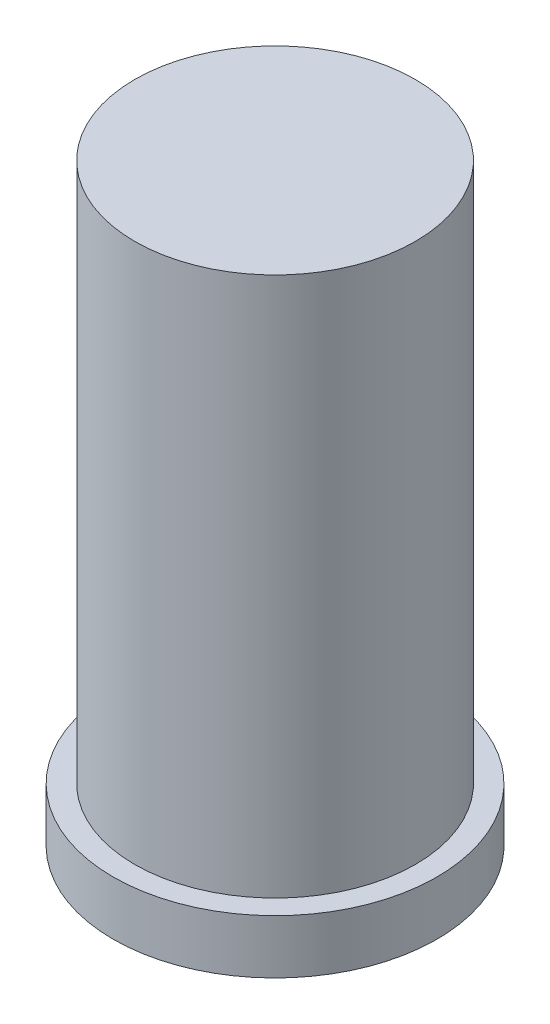
ISO-10303-21;
HEADER;
FILE_DESCRIPTION(('STEP AP214'),'2;1');
FILE_NAME('part.step','',(''),(''),'','','');
FILE_SCHEMA(('AUTOMOTIVE_DESIGN { 1 0 10303 214 1 1 1 1 }'));
ENDSEC;
DATA;
#1=APPLICATION_CONTEXT('core data for automotive mechanical design processes');
#2=APPLICATION_PROTOCOL_DEFINITION('international standard','automotive_design',2000,#1);
#3=PRODUCT_CONTEXT('',#1,'mechanical');
#4=PRODUCT('Part','Part','',(#3));
#5=PRODUCT_RELATED_PRODUCT_CATEGORY('part','',(#4));
#6=PRODUCT_DEFINITION_FORMATION('','',#4);
#7=PRODUCT_DEFINITION_CONTEXT('part definition',#1,'design');
#8=PRODUCT_DEFINITION('design','',#6,#7);
#9=PRODUCT_DEFINITION_SHAPE('','',#8);
#10=(LENGTH_UNIT() NAMED_UNIT(*) SI_UNIT(.MILLI.,.METRE.));
#11=(NAMED_UNIT(*) PLANE_ANGLE_UNIT() SI_UNIT($,.RADIAN.));
#12=(NAMED_UNIT(*) SI_UNIT($,.STERADIAN.) SOLID_ANGLE_UNIT());
#13=UNCERTAINTY_MEASURE_WITH_UNIT(LENGTH_MEASURE(1.E-05),#10,'distance_accuracy_value','');
#14=(GEOMETRIC_REPRESENTATION_CONTEXT(3) GLOBAL_UNCERTAINTY_ASSIGNED_CONTEXT((#13)) GLOBAL_UNIT_ASSIGNED_CONTEXT((#10,
#11,#12)) REPRESENTATION_CONTEXT('',''));
#15=CARTESIAN_POINT('',(0.,0.,0.));
#16=DIRECTION('',(0.,0.,1.));
#17=DIRECTION('',(1.,0.,0.));
#18=AXIS2_PLACEMENT_3D('',#15,#16,#17);
#19=CARTESIAN_POINT('',(0.,0.5,0.));
#20=DIRECTION('',(0.,-1.,0.));
#21=DIRECTION('',(0.,0.,-1.));
#22=AXIS2_PLACEMENT_3D('',#19,#20,#21);
#23=CYLINDRICAL_SURFACE('',#22,1.5);
#24=CARTESIAN_POINT('',(0.,0.5,0.));
#25=DIRECTION('',(0.,1.,0.));
#26=DIRECTION('',(0.,0.,1.));
#27=AXIS2_PLACEMENT_3D('',#24,#25,#26);
#28=CIRCLE('',#27,1.5);
#29=CARTESIAN_POINT('',(0.,0.5,1.5));
#30=VERTEX_POINT('',#29);
#31=EDGE_CURVE('E53',#30,#30,#28,.T.);
#32=ORIENTED_EDGE('',*,*,#31,.F.);
#33=EDGE_LOOP('',(#32));
#34=FACE_BOUND('',#33,.T.);
#35=CARTESIAN_POINT('',(0.,0.,0.));
#36=DIRECTION('',(0.,1.,0.));
#37=DIRECTION('',(0.,0.,1.));
#38=AXIS2_PLACEMENT_3D('',#35,#36,#37);
#39=CIRCLE('',#38,1.5);
#40=CARTESIAN_POINT('',(0.,0.,1.5));
#41=VERTEX_POINT('',#40);
#42=EDGE_CURVE('E48',#41,#41,#39,.T.);
#43=ORIENTED_EDGE('',*,*,#42,.T.);
#44=EDGE_LOOP('',(#43));
#45=FACE_BOUND('',#44,.T.);
#46=ADVANCED_FACE('F45',(#34,#45),#23,.T.);
#47=CARTESIAN_POINT('',(0.,0.5,0.));
#48=DIRECTION('',(0.,1.,0.));
#49=DIRECTION('',(0.,0.,1.));
#50=AXIS2_PLACEMENT_3D('',#47,#48,#49);
#51=PLANE('',#50);
#52=CARTESIAN_POINT('',(0.,0.5,0.));
#53=DIRECTION('',(0.,1.,0.));
#54=DIRECTION('',(0.,0.,1.));
#55=AXIS2_PLACEMENT_3D('',#52,#53,#54);
#56=CIRCLE('',#55,1.3);
#57=CARTESIAN_POINT('',(0.,0.5,1.3));
#58=VERTEX_POINT('',#57);
#59=EDGE_CURVE('E10',#58,#58,#56,.T.);
#60=ORIENTED_EDGE('',*,*,#59,.F.);
#61=EDGE_LOOP('',(#60));
#62=FACE_BOUND('',#61,.T.);
#63=ORIENTED_EDGE('',*,*,#31,.T.);
#64=EDGE_LOOP('',(#63));
#65=FACE_BOUND('',#64,.T.);
#66=ADVANCED_FACE('F73',(#62,#65),#51,.T.);
#67=CARTESIAN_POINT('',(0.,0.,0.));
#68=DIRECTION('',(0.,1.,0.));
#69=DIRECTION('',(0.,0.,1.));
#70=AXIS2_PLACEMENT_3D('',#67,#68,#69);
#71=PLANE('',#70);
#72=ORIENTED_EDGE('',*,*,#42,.F.);
#73=EDGE_LOOP('',(#72));
#74=FACE_BOUND('',#73,.T.);
#75=ADVANCED_FACE('F70',(#74),#71,.F.);
#76=CARTESIAN_POINT('',(0.,5.5,0.));
#77=DIRECTION('',(0.,-1.,0.));
#78=DIRECTION('',(0.,0.,-1.));
#79=AXIS2_PLACEMENT_3D('',#76,#77,#78);
#80=CYLINDRICAL_SURFACE('',#79,1.3);
#81=CARTESIAN_POINT('',(0.,5.5,0.));
#82=DIRECTION('',(0.,1.,0.));
#83=DIRECTION('',(0.,0.,1.));
#84=AXIS2_PLACEMENT_3D('',#81,#82,#83);
#85=CIRCLE('',#84,1.3);
#86=CARTESIAN_POINT('',(0.,5.5,1.3));
#87=VERTEX_POINT('',#86);
#88=EDGE_CURVE('E60',#87,#87,#85,.T.);
#89=ORIENTED_EDGE('',*,*,#88,.F.);
#90=EDGE_LOOP('',(#89));
#91=FACE_BOUND('',#90,.T.);
#92=ORIENTED_EDGE('',*,*,#59,.T.);
#93=EDGE_LOOP('',(#92));
#94=FACE_BOUND('',#93,.T.);
#95=ADVANCED_FACE('F72',(#91,#94),#80,.T.);
#96=CARTESIAN_POINT('',(0.,5.5,0.));
#97=DIRECTION('',(0.,1.,0.));
#98=DIRECTION('',(0.,0.,1.));
#99=AXIS2_PLACEMENT_3D('',#96,#97,#98);
#100=PLANE('',#99);
#101=ORIENTED_EDGE('',*,*,#88,.T.);
#102=EDGE_LOOP('',(#101));
#103=FACE_BOUND('',#102,.T.);
#104=ADVANCED_FACE('F79',(#103),#100,.T.);
#105=CLOSED_SHELL('',(#46,#66,#75,#95,#104));
#106=MANIFOLD_SOLID_BREP('B2',#105);
#107=ADVANCED_BREP_SHAPE_REPRESENTATION('',(#18,#106),#14);
#108=SHAPE_DEFINITION_REPRESENTATION(#9,#107);
ENDSEC;
END-ISO-10303-21;
